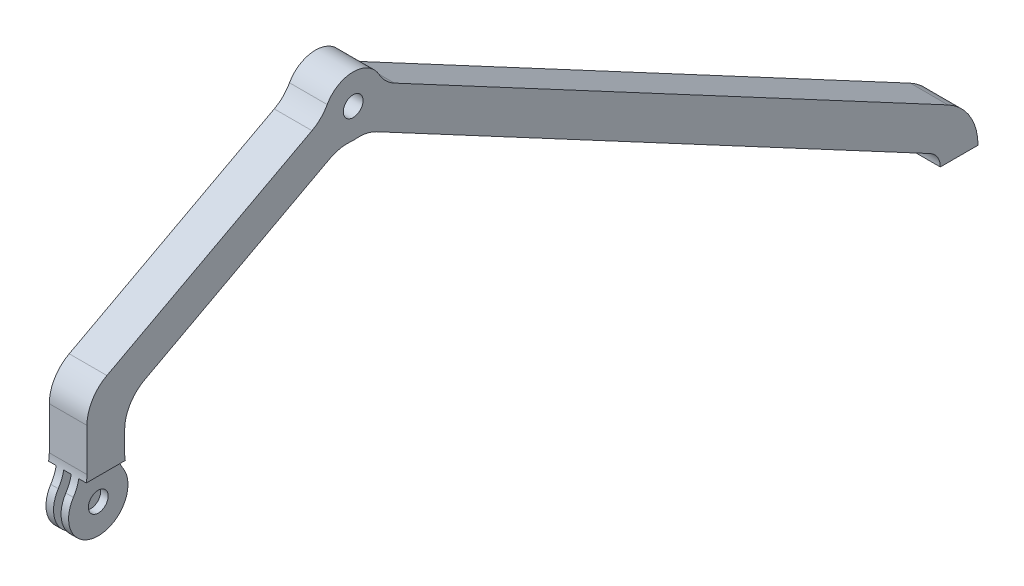
ISO-10303-21;
HEADER;
FILE_DESCRIPTION(('STEP AP214'),'2;1');
FILE_NAME('part.step','',(''),(''),'','','');
FILE_SCHEMA(('AUTOMOTIVE_DESIGN { 1 0 10303 214 1 1 1 1 }'));
ENDSEC;
DATA;
#1=APPLICATION_CONTEXT('core data for automotive mechanical design processes');
#2=APPLICATION_PROTOCOL_DEFINITION('international standard','automotive_design',2000,#1);
#3=PRODUCT_CONTEXT('',#1,'mechanical');
#4=PRODUCT('Part','Part','',(#3));
#5=PRODUCT_RELATED_PRODUCT_CATEGORY('part','',(#4));
#6=PRODUCT_DEFINITION_FORMATION('','',#4);
#7=PRODUCT_DEFINITION_CONTEXT('part definition',#1,'design');
#8=PRODUCT_DEFINITION('design','',#6,#7);
#9=PRODUCT_DEFINITION_SHAPE('','',#8);
#10=(LENGTH_UNIT() NAMED_UNIT(*) SI_UNIT(.MILLI.,.METRE.));
#11=(NAMED_UNIT(*) PLANE_ANGLE_UNIT() SI_UNIT($,.RADIAN.));
#12=(NAMED_UNIT(*) SI_UNIT($,.STERADIAN.) SOLID_ANGLE_UNIT());
#13=UNCERTAINTY_MEASURE_WITH_UNIT(LENGTH_MEASURE(1.E-05),#10,'distance_accuracy_value','');
#14=(GEOMETRIC_REPRESENTATION_CONTEXT(3) GLOBAL_UNCERTAINTY_ASSIGNED_CONTEXT((#13)) GLOBAL_UNIT_ASSIGNED_CONTEXT((#10,
#11,#12)) REPRESENTATION_CONTEXT('',''));
#15=CARTESIAN_POINT('',(0.,0.,0.));
#16=DIRECTION('',(0.,0.,1.));
#17=DIRECTION('',(1.,0.,0.));
#18=AXIS2_PLACEMENT_3D('',#15,#16,#17);
#19=CARTESIAN_POINT('',(-19.05,145.348430694647,19.0500000000001));
#20=DIRECTION('',(1.,0.,0.));
#21=DIRECTION('',(0.,0.,-1.));
#22=AXIS2_PLACEMENT_3D('',#19,#20,#21);
#23=PLANE('',#22);
#24=CARTESIAN_POINT('',(-19.05,225.,-250.));
#25=DIRECTION('',(1.,0.,0.));
#26=DIRECTION('',(0.,0.,-1.));
#27=AXIS2_PLACEMENT_3D('',#24,#25,#26);
#28=CIRCLE('',#27,10.0000000000001);
#29=CARTESIAN_POINT('',(-19.05,225.,-260.));
#30=VERTEX_POINT('',#29);
#31=EDGE_CURVE('E338',#30,#30,#28,.T.);
#32=ORIENTED_EDGE('',*,*,#31,.T.);
#33=EDGE_LOOP('',(#32));
#34=FACE_BOUND('',#33,.T.);
#35=DIRECTION('',(0.,0.,-1.));
#36=VECTOR('',#35,1.);
#37=CARTESIAN_POINT('',(-19.05,30.,19.0500000000001));
#38=LINE('',#37,#36);
#39=CARTESIAN_POINT('',(-19.05,30.,19.7048604417046));
#40=VERTEX_POINT('',#39);
#41=CARTESIAN_POINT('',(-19.05,30.,-19.7048604417045));
#42=VERTEX_POINT('',#41);
#43=EDGE_CURVE('E45',#40,#42,#38,.T.);
#44=ORIENTED_EDGE('',*,*,#43,.F.);
#45=CARTESIAN_POINT('',(-19.05,37.0335996090037,57.15));
#46=DIRECTION('',(1.,0.,0.));
#47=DIRECTION('',(0.,0.,-1.));
#48=AXIS2_PLACEMENT_3D('',#45,#46,#47);
#49=CIRCLE('',#48,38.1);
#50=CARTESIAN_POINT('',(-19.05,37.0335996090037,19.05));
#51=VERTEX_POINT('',#50);
#52=EDGE_CURVE('E240',#40,#51,#49,.T.);
#53=ORIENTED_EDGE('',*,*,#52,.T.);
#54=DIRECTION('',(0.,-1.,0.));
#55=VECTOR('',#54,1.);
#56=CARTESIAN_POINT('',(-19.05,145.348430694647,19.0500000000001));
#57=LINE('',#56,#55);
#58=CARTESIAN_POINT('',(-19.05,80.0449488571474,19.0500000000001));
#59=VERTEX_POINT('',#58);
#60=EDGE_CURVE('E351',#59,#51,#57,.T.);
#61=ORIENTED_EDGE('',*,*,#60,.F.);
#62=CARTESIAN_POINT('',(-19.05,80.0449488571474,-19.0499999999999));
#63=DIRECTION('',(1.,0.,0.));
#64=DIRECTION('',(0.,0.,-1.));
#65=AXIS2_PLACEMENT_3D('',#62,#63,#64);
#66=CIRCLE('',#65,38.1);
#67=CARTESIAN_POINT('',(-19.05,113.651438700337,-1.09968411365502));
#68=VERTEX_POINT('',#67);
#69=EDGE_CURVE('E424',#59,#68,#66,.F.);
#70=ORIENTED_EDGE('',*,*,#69,.T.);
#71=DIRECTION('',(0.,0.471136899904066,-0.882060100871129));
#72=VECTOR('',#71,1.);
#73=CARTESIAN_POINT('',(-19.05,102.888839079316,19.0500000000001));
#74=LINE('',#73,#72);
#75=CARTESIAN_POINT('',(-19.05,224.35534960952,-208.358981450089));
#76=VERTEX_POINT('',#75);
#77=EDGE_CURVE('E358',#68,#76,#74,.T.);
#78=ORIENTED_EDGE('',*,*,#77,.T.);
#79=CARTESIAN_POINT('',(-19.05,257.96183945271,-190.408665563744));
#80=DIRECTION('',(1.,0.,0.));
#81=DIRECTION('',(0.,0.,-1.));
#82=AXIS2_PLACEMENT_3D('',#79,#80,#81);
#83=CIRCLE('',#82,38.1);
#84=CARTESIAN_POINT('',(-19.05,239.520634120137,-223.748310821032));
#85=VERTEX_POINT('',#84);
#86=EDGE_CURVE('E261',#76,#85,#83,.T.);
#87=ORIENTED_EDGE('',*,*,#86,.T.);
#88=CARTESIAN_POINT('',(-19.05,225.,-250.));
#89=DIRECTION('',(1.,0.,0.));
#90=DIRECTION('',(0.,0.,-1.));
#91=AXIS2_PLACEMENT_3D('',#88,#89,#90);
#92=CIRCLE('',#91,30.);
#93=CARTESIAN_POINT('',(-19.05,239.520634120137,-276.251689178967));
#94=VERTEX_POINT('',#93);
#95=EDGE_CURVE('E334',#85,#94,#92,.F.);
#96=ORIENTED_EDGE('',*,*,#95,.T.);
#97=CARTESIAN_POINT('',(-19.05,257.96183945271,-309.591334436256));
#98=DIRECTION('',(1.,0.,0.));
#99=DIRECTION('',(0.,0.,-1.));
#100=AXIS2_PLACEMENT_3D('',#97,#98,#99);
#101=CIRCLE('',#100,38.1);
#102=CARTESIAN_POINT('',(-19.05,224.35534960952,-291.641018549911));
#103=VERTEX_POINT('',#102);
#104=EDGE_CURVE('E257',#94,#103,#101,.T.);
#105=ORIENTED_EDGE('',*,*,#104,.T.);
#106=DIRECTION('',(0.,-0.471136899904065,-0.882060100871129));
#107=VECTOR('',#106,1.);
#108=CARTESIAN_POINT('',(-19.05,246.597167790705,-250.));
#109=LINE('',#108,#107);
#110=CARTESIAN_POINT('',(-19.05,-74.590265235215,-851.325473829517));
#111=VERTEX_POINT('',#110);
#112=EDGE_CURVE('E372',#103,#111,#109,.T.);
#113=ORIENTED_EDGE('',*,*,#112,.T.);
#114=CARTESIAN_POINT('',(-19.05,-125.,-824.4));
#115=DIRECTION('',(-1.,0.,0.));
#116=DIRECTION('',(0.,0.,1.));
#117=AXIS2_PLACEMENT_3D('',#114,#115,#116);
#118=CIRCLE('',#117,57.1499999999999);
#119=CARTESIAN_POINT('',(-19.05,-125.,-881.55));
#120=VERTEX_POINT('',#119);
#121=EDGE_CURVE('E394',#111,#120,#118,.T.);
#122=ORIENTED_EDGE('',*,*,#121,.T.);
#123=DIRECTION('',(0.,0.,-1.));
#124=VECTOR('',#123,1.);
#125=CARTESIAN_POINT('',(-19.05,-125.,-764.694084134161));
#126=LINE('',#125,#124);
#127=CARTESIAN_POINT('',(-19.05,-125.,-843.45));
#128=VERTEX_POINT('',#127);
#129=EDGE_CURVE('E385',#128,#120,#126,.T.);
#130=ORIENTED_EDGE('',*,*,#129,.F.);
#131=CARTESIAN_POINT('',(-19.05,-125.,-824.4));
#132=DIRECTION('',(-1.,0.,0.));
#133=DIRECTION('',(0.,0.,1.));
#134=AXIS2_PLACEMENT_3D('',#131,#132,#133);
#135=CIRCLE('',#134,19.05);
#136=CARTESIAN_POINT('',(-19.05,-108.196755078405,-833.375157943173));
#137=VERTEX_POINT('',#136);
#138=EDGE_CURVE('E397',#137,#128,#135,.T.);
#139=ORIENTED_EDGE('',*,*,#138,.F.);
#140=DIRECTION('',(0.,-0.471136899904065,-0.882060100871129));
#141=VECTOR('',#140,1.);
#142=CARTESIAN_POINT('',(-19.05,203.402832209295,-250.));
#143=LINE('',#142,#141);
#144=CARTESIAN_POINT('',(-19.05,190.74885976633,-273.690702663566));
#145=VERTEX_POINT('',#144);
#146=EDGE_CURVE('E374',#145,#137,#143,.T.);
#147=ORIENTED_EDGE('',*,*,#146,.F.);
#148=CARTESIAN_POINT('',(-19.05,157.14236992314,-255.740386777221));
#149=DIRECTION('',(1.,0.,0.));
#150=DIRECTION('',(0.,0.,-1.));
#151=AXIS2_PLACEMENT_3D('',#148,#149,#150);
#152=CIRCLE('',#151,38.1);
#153=CARTESIAN_POINT('',(-19.05,195.106770891251,-252.528804747675));
#154=VERTEX_POINT('',#153);
#155=EDGE_CURVE('E242',#145,#154,#152,.T.);
#156=ORIENTED_EDGE('',*,*,#155,.T.);
#157=CARTESIAN_POINT('',(-19.05,195.106770891251,-247.471195252325));
#158=VERTEX_POINT('',#157);
#159=EDGE_CURVE('E330',#154,#158,#92,.F.);
#160=ORIENTED_EDGE('',*,*,#159,.T.);
#161=CARTESIAN_POINT('',(-19.05,157.14236992314,-244.259613222778));
#162=DIRECTION('',(1.,0.,0.));
#163=DIRECTION('',(0.,0.,-1.));
#164=AXIS2_PLACEMENT_3D('',#161,#162,#163);
#165=CIRCLE('',#164,38.1);
#166=CARTESIAN_POINT('',(-19.05,190.74885976633,-226.309297336434));
#167=VERTEX_POINT('',#166);
#168=EDGE_CURVE('E251',#158,#167,#165,.T.);
#169=ORIENTED_EDGE('',*,*,#168,.T.);
#170=DIRECTION('',(0.,0.471136899904066,-0.882060100871129));
#171=VECTOR('',#170,1.);
#172=CARTESIAN_POINT('',(-19.05,80.0449488571474,-19.0499999999999));
#173=LINE('',#172,#171);
#174=CARTESIAN_POINT('',(-19.05,90.8075484781688,-39.1996841136551));
#175=VERTEX_POINT('',#174);
#176=EDGE_CURVE('E361',#175,#167,#173,.T.);
#177=ORIENTED_EDGE('',*,*,#176,.F.);
#178=CARTESIAN_POINT('',(-19.05,57.2010586349788,-57.15));
#179=DIRECTION('',(1.,0.,0.));
#180=DIRECTION('',(0.,0.,-1.));
#181=AXIS2_PLACEMENT_3D('',#178,#179,#180);
#182=CIRCLE('',#181,38.1);
#183=CARTESIAN_POINT('',(-19.05,57.2010586349788,-19.05));
#184=VERTEX_POINT('',#183);
#185=EDGE_CURVE('E449',#175,#184,#182,.T.);
#186=ORIENTED_EDGE('',*,*,#185,.T.);
#187=DIRECTION('',(0.,-1.,0.));
#188=VECTOR('',#187,1.);
#189=CARTESIAN_POINT('',(-19.05,145.348430694647,-19.0499999999999));
#190=LINE('',#189,#188);
#191=CARTESIAN_POINT('',(-19.05,37.0335996090037,-19.05));
#192=VERTEX_POINT('',#191);
#193=EDGE_CURVE('E238',#184,#192,#190,.T.);
#194=ORIENTED_EDGE('',*,*,#193,.T.);
#195=CARTESIAN_POINT('',(-19.05,37.0335996090037,-57.15));
#196=DIRECTION('',(1.,0.,0.));
#197=DIRECTION('',(0.,0.,-1.));
#198=AXIS2_PLACEMENT_3D('',#195,#196,#197);
#199=CIRCLE('',#198,38.1);
#200=EDGE_CURVE('E232',#192,#42,#199,.T.);
#201=ORIENTED_EDGE('',*,*,#200,.T.);
#202=EDGE_LOOP('',(#44,#53,#61,#70,#78,#87,#96,#105,#113,#122,#130,#139,#147,#156,#160,#169,
#177,#186,#194,#201));
#203=FACE_BOUND('',#202,.T.);
#204=ADVANCED_FACE('F37',(#34,#203),#23,.F.);
#205=CARTESIAN_POINT('',(-19.05,0.,0.));
#206=DIRECTION('',(1.,0.,0.));
#207=DIRECTION('',(0.,0.,-1.));
#208=AXIS2_PLACEMENT_3D('',#205,#206,#207);
#209=CYLINDRICAL_SURFACE('',#208,10.);
#210=CARTESIAN_POINT('',(-11.43,0.,0.));
#211=DIRECTION('',(1.,0.,0.));
#212=DIRECTION('',(0.,0.,-1.));
#213=AXIS2_PLACEMENT_3D('',#210,#211,#212);
#214=CIRCLE('',#213,10.);
#215=CARTESIAN_POINT('',(-11.43,0.,-10.));
#216=VERTEX_POINT('',#215);
#217=EDGE_CURVE('E298',#216,#216,#214,.F.);
#218=ORIENTED_EDGE('',*,*,#217,.T.);
#219=EDGE_LOOP('',(#218));
#220=FACE_BOUND('',#219,.T.);
#221=CARTESIAN_POINT('',(-3.81,0.,0.));
#222=DIRECTION('',(1.,0.,0.));
#223=DIRECTION('',(0.,0.,-1.));
#224=AXIS2_PLACEMENT_3D('',#221,#222,#223);
#225=CIRCLE('',#224,10.);
#226=CARTESIAN_POINT('',(-3.81,0.,-10.));
#227=VERTEX_POINT('',#226);
#228=EDGE_CURVE('E310',#227,#227,#225,.F.);
#229=ORIENTED_EDGE('',*,*,#228,.F.);
#230=EDGE_LOOP('',(#229));
#231=FACE_BOUND('',#230,.T.);
#232=ADVANCED_FACE('F561',(#220,#231),#209,.F.);
#233=CARTESIAN_POINT('',(-103.902813742386,0.,0.));
#234=DIRECTION('',(1.,0.,0.));
#235=DIRECTION('',(0.,0.,-1.));
#236=AXIS2_PLACEMENT_3D('',#233,#234,#235);
#237=CYLINDRICAL_SURFACE('',#236,30.);
#238=DIRECTION('',(1.,0.,0.));
#239=VECTOR('',#238,1.);
#240=CARTESIAN_POINT('',(-103.902813742386,16.3143610612351,25.1762114537445));
#241=LINE('',#240,#239);
#242=CARTESIAN_POINT('',(-3.81000000000001,16.3143610612351,25.1762114537445));
#243=VERTEX_POINT('',#242);
#244=CARTESIAN_POINT('',(-11.43,16.3143610612351,25.1762114537445));
#245=VERTEX_POINT('',#244);
#246=EDGE_CURVE('E429',#243,#245,#241,.F.);
#247=ORIENTED_EDGE('',*,*,#246,.T.);
#248=CARTESIAN_POINT('',(-11.43,0.,0.));
#249=DIRECTION('',(1.,0.,0.));
#250=DIRECTION('',(0.,0.,-1.));
#251=AXIS2_PLACEMENT_3D('',#248,#249,#250);
#252=CIRCLE('',#251,30.);
#253=CARTESIAN_POINT('',(-11.43,16.3143610612351,-25.1762114537445));
#254=VERTEX_POINT('',#253);
#255=EDGE_CURVE('E553',#254,#245,#252,.F.);
#256=ORIENTED_EDGE('',*,*,#255,.F.);
#257=DIRECTION('',(1.,0.,0.));
#258=VECTOR('',#257,1.);
#259=CARTESIAN_POINT('',(-103.902813742386,16.3143610612351,-25.1762114537445));
#260=LINE('',#259,#258);
#261=CARTESIAN_POINT('',(-3.81000000000001,16.3143610612351,-25.1762114537445));
#262=VERTEX_POINT('',#261);
#263=EDGE_CURVE('E427',#254,#262,#260,.T.);
#264=ORIENTED_EDGE('',*,*,#263,.T.);
#265=CARTESIAN_POINT('',(-3.81000000000001,0.,0.));
#266=DIRECTION('',(1.,0.,0.));
#267=DIRECTION('',(0.,0.,-1.));
#268=AXIS2_PLACEMENT_3D('',#265,#266,#267);
#269=CIRCLE('',#268,30.);
#270=EDGE_CURVE('E281',#262,#243,#269,.F.);
#271=ORIENTED_EDGE('',*,*,#270,.T.);
#272=EDGE_LOOP('',(#247,#256,#264,#271));
#273=FACE_BOUND('',#272,.T.);
#274=ADVANCED_FACE('F552',(#273),#237,.T.);
#275=CARTESIAN_POINT('',(11.43,16.3143610612351,25.1762114537445));
#276=VERTEX_POINT('',#275);
#277=CARTESIAN_POINT('',(3.80999999999999,16.3143610612351,25.1762114537445));
#278=VERTEX_POINT('',#277);
#279=EDGE_CURVE('E430',#276,#278,#241,.F.);
#280=ORIENTED_EDGE('',*,*,#279,.T.);
#281=CARTESIAN_POINT('',(3.80999999999999,0.,0.));
#282=DIRECTION('',(1.,0.,0.));
#283=DIRECTION('',(0.,0.,-1.));
#284=AXIS2_PLACEMENT_3D('',#281,#282,#283);
#285=CIRCLE('',#284,30.);
#286=CARTESIAN_POINT('',(3.80999999999999,16.3143610612351,-25.1762114537445));
#287=VERTEX_POINT('',#286);
#288=EDGE_CURVE('E296',#287,#278,#285,.F.);
#289=ORIENTED_EDGE('',*,*,#288,.F.);
#290=CARTESIAN_POINT('',(11.43,16.3143610612351,-25.1762114537445));
#291=VERTEX_POINT('',#290);
#292=EDGE_CURVE('E426',#287,#291,#260,.T.);
#293=ORIENTED_EDGE('',*,*,#292,.T.);
#294=CARTESIAN_POINT('',(11.43,0.,0.));
#295=DIRECTION('',(1.,0.,0.));
#296=DIRECTION('',(0.,0.,-1.));
#297=AXIS2_PLACEMENT_3D('',#294,#295,#296);
#298=CIRCLE('',#297,30.);
#299=EDGE_CURVE('E321',#291,#276,#298,.F.);
#300=ORIENTED_EDGE('',*,*,#299,.T.);
#301=EDGE_LOOP('',(#280,#289,#293,#300));
#302=FACE_BOUND('',#301,.T.);
#303=ADVANCED_FACE('F545',(#302),#237,.T.);
#304=CARTESIAN_POINT('',(-103.902813742386,37.0335996090037,57.15));
#305=DIRECTION('',(1.,0.,0.));
#306=DIRECTION('',(0.,0.,-1.));
#307=AXIS2_PLACEMENT_3D('',#304,#305,#306);
#308=CYLINDRICAL_SURFACE('',#307,38.1);
#309=DIRECTION('',(1.,0.,0.));
#310=VECTOR('',#309,1.);
#311=CARTESIAN_POINT('',(-103.902813742386,30.,19.7048604417046));
#312=LINE('',#311,#310);
#313=CARTESIAN_POINT('',(-11.43,30.,19.7048604417046));
#314=VERTEX_POINT('',#313);
#315=EDGE_CURVE('E52',#314,#40,#312,.F.);
#316=ORIENTED_EDGE('',*,*,#315,.F.);
#317=CARTESIAN_POINT('',(-11.43,37.0335996090037,57.15));
#318=DIRECTION('',(1.,0.,0.));
#319=DIRECTION('',(0.,0.,-1.));
#320=AXIS2_PLACEMENT_3D('',#317,#318,#319);
#321=CIRCLE('',#320,38.1);
#322=EDGE_CURVE('E549',#314,#245,#321,.F.);
#323=ORIENTED_EDGE('',*,*,#322,.T.);
#324=ORIENTED_EDGE('',*,*,#246,.F.);
#325=CARTESIAN_POINT('',(-3.81000000000001,37.0335996090037,57.15));
#326=DIRECTION('',(1.,0.,0.));
#327=DIRECTION('',(0.,0.,-1.));
#328=AXIS2_PLACEMENT_3D('',#325,#326,#327);
#329=CIRCLE('',#328,38.1);
#330=CARTESIAN_POINT('',(-3.81,30.,19.7048604417046));
#331=VERTEX_POINT('',#330);
#332=EDGE_CURVE('E308',#331,#243,#329,.F.);
#333=ORIENTED_EDGE('',*,*,#332,.F.);
#334=DIRECTION('',(1.,0.,0.));
#335=VECTOR('',#334,1.);
#336=CARTESIAN_POINT('',(-103.902813742386,30.,19.7048604417046));
#337=LINE('',#336,#335);
#338=CARTESIAN_POINT('',(3.81,30.,19.7048604417046));
#339=VERTEX_POINT('',#338);
#340=EDGE_CURVE('E294',#339,#331,#337,.F.);
#341=ORIENTED_EDGE('',*,*,#340,.F.);
#342=CARTESIAN_POINT('',(3.80999999999999,37.0335996090037,57.15));
#343=DIRECTION('',(1.,0.,0.));
#344=DIRECTION('',(0.,0.,-1.));
#345=AXIS2_PLACEMENT_3D('',#342,#343,#344);
#346=CIRCLE('',#345,38.1);
#347=EDGE_CURVE('E293',#339,#278,#346,.F.);
#348=ORIENTED_EDGE('',*,*,#347,.T.);
#349=ORIENTED_EDGE('',*,*,#279,.F.);
#350=CARTESIAN_POINT('',(11.43,37.0335996090037,57.15));
#351=DIRECTION('',(1.,0.,0.));
#352=DIRECTION('',(0.,0.,-1.));
#353=AXIS2_PLACEMENT_3D('',#350,#351,#352);
#354=CIRCLE('',#353,38.1);
#355=CARTESIAN_POINT('',(11.43,30.,19.7048604417046));
#356=VERTEX_POINT('',#355);
#357=EDGE_CURVE('E323',#356,#276,#354,.F.);
#358=ORIENTED_EDGE('',*,*,#357,.F.);
#359=DIRECTION('',(1.,0.,0.));
#360=VECTOR('',#359,1.);
#361=CARTESIAN_POINT('',(-103.902813742386,30.,19.7048604417046));
#362=LINE('',#361,#360);
#363=CARTESIAN_POINT('',(19.05,30.,19.7048604417046));
#364=VERTEX_POINT('',#363);
#365=EDGE_CURVE('E319',#364,#356,#362,.F.);
#366=ORIENTED_EDGE('',*,*,#365,.F.);
#367=CARTESIAN_POINT('',(19.05,37.0335996090037,57.15));
#368=DIRECTION('',(-1.,0.,0.));
#369=DIRECTION('',(0.,0.,1.));
#370=AXIS2_PLACEMENT_3D('',#367,#368,#369);
#371=CIRCLE('',#370,38.1);
#372=CARTESIAN_POINT('',(19.05,37.0335996090037,19.05));
#373=VERTEX_POINT('',#372);
#374=EDGE_CURVE('E244',#373,#364,#371,.T.);
#375=ORIENTED_EDGE('',*,*,#374,.F.);
#376=DIRECTION('',(1.,0.,0.));
#377=VECTOR('',#376,1.);
#378=CARTESIAN_POINT('',(-19.05,37.0335996090037,19.05));
#379=LINE('',#378,#377);
#380=EDGE_CURVE('E419',#51,#373,#379,.T.);
#381=ORIENTED_EDGE('',*,*,#380,.F.);
#382=ORIENTED_EDGE('',*,*,#52,.F.);
#383=EDGE_LOOP('',(#316,#323,#324,#333,#341,#348,#349,#358,#366,#375,#381,#382));
#384=FACE_BOUND('',#383,.T.);
#385=ADVANCED_FACE('F460',(#384),#308,.F.);
#386=CARTESIAN_POINT('',(-103.902813742386,37.0335996090037,-57.15));
#387=DIRECTION('',(1.,0.,0.));
#388=DIRECTION('',(0.,0.,-1.));
#389=AXIS2_PLACEMENT_3D('',#386,#387,#388);
#390=CYLINDRICAL_SURFACE('',#389,38.1);
#391=ORIENTED_EDGE('',*,*,#263,.F.);
#392=CARTESIAN_POINT('',(-11.43,37.0335996090037,-57.15));
#393=DIRECTION('',(1.,0.,0.));
#394=DIRECTION('',(0.,0.,-1.));
#395=AXIS2_PLACEMENT_3D('',#392,#393,#394);
#396=CIRCLE('',#395,38.1);
#397=CARTESIAN_POINT('',(-11.43,30.,-19.7048604417045));
#398=VERTEX_POINT('',#397);
#399=EDGE_CURVE('E12',#254,#398,#396,.F.);
#400=ORIENTED_EDGE('',*,*,#399,.T.);
#401=DIRECTION('',(1.,0.,0.));
#402=VECTOR('',#401,1.);
#403=CARTESIAN_POINT('',(-103.902813742386,30.,-19.7048604417045));
#404=LINE('',#403,#402);
#405=EDGE_CURVE('E222',#42,#398,#404,.T.);
#406=ORIENTED_EDGE('',*,*,#405,.F.);
#407=ORIENTED_EDGE('',*,*,#200,.F.);
#408=DIRECTION('',(1.,0.,0.));
#409=VECTOR('',#408,1.);
#410=CARTESIAN_POINT('',(-19.05,37.0335996090037,-19.05));
#411=LINE('',#410,#409);
#412=CARTESIAN_POINT('',(19.05,37.0335996090037,-19.05));
#413=VERTEX_POINT('',#412);
#414=EDGE_CURVE('E408',#413,#192,#411,.F.);
#415=ORIENTED_EDGE('',*,*,#414,.F.);
#416=CARTESIAN_POINT('',(19.05,37.0335996090037,-57.15));
#417=DIRECTION('',(-1.,0.,0.));
#418=DIRECTION('',(0.,0.,1.));
#419=AXIS2_PLACEMENT_3D('',#416,#417,#418);
#420=CIRCLE('',#419,38.1);
#421=CARTESIAN_POINT('',(19.05,30.,-19.7048604417045));
#422=VERTEX_POINT('',#421);
#423=EDGE_CURVE('E239',#422,#413,#420,.T.);
#424=ORIENTED_EDGE('',*,*,#423,.F.);
#425=DIRECTION('',(1.,0.,0.));
#426=VECTOR('',#425,1.);
#427=CARTESIAN_POINT('',(-103.902813742386,30.,-19.7048604417045));
#428=LINE('',#427,#426);
#429=CARTESIAN_POINT('',(11.43,30.,-19.7048604417045));
#430=VERTEX_POINT('',#429);
#431=EDGE_CURVE('E263',#430,#422,#428,.T.);
#432=ORIENTED_EDGE('',*,*,#431,.F.);
#433=CARTESIAN_POINT('',(11.43,37.0335996090037,-57.15));
#434=DIRECTION('',(1.,0.,0.));
#435=DIRECTION('',(0.,0.,-1.));
#436=AXIS2_PLACEMENT_3D('',#433,#434,#435);
#437=CIRCLE('',#436,38.1);
#438=EDGE_CURVE('E265',#291,#430,#437,.F.);
#439=ORIENTED_EDGE('',*,*,#438,.F.);
#440=ORIENTED_EDGE('',*,*,#292,.F.);
#441=CARTESIAN_POINT('',(3.80999999999999,37.0335996090037,-57.15));
#442=DIRECTION('',(1.,0.,0.));
#443=DIRECTION('',(0.,0.,-1.));
#444=AXIS2_PLACEMENT_3D('',#441,#442,#443);
#445=CIRCLE('',#444,38.1);
#446=CARTESIAN_POINT('',(3.81,30.,-19.7048604417045));
#447=VERTEX_POINT('',#446);
#448=EDGE_CURVE('E270',#287,#447,#445,.F.);
#449=ORIENTED_EDGE('',*,*,#448,.T.);
#450=DIRECTION('',(1.,0.,0.));
#451=VECTOR('',#450,1.);
#452=CARTESIAN_POINT('',(-103.902813742386,30.,-19.7048604417045));
#453=LINE('',#452,#451);
#454=CARTESIAN_POINT('',(-3.81000000000001,30.,-19.7048604417045));
#455=VERTEX_POINT('',#454);
#456=EDGE_CURVE('E268',#455,#447,#453,.T.);
#457=ORIENTED_EDGE('',*,*,#456,.F.);
#458=CARTESIAN_POINT('',(-3.81000000000001,37.0335996090037,-57.15));
#459=DIRECTION('',(1.,0.,0.));
#460=DIRECTION('',(0.,0.,-1.));
#461=AXIS2_PLACEMENT_3D('',#458,#459,#460);
#462=CIRCLE('',#461,38.1);
#463=EDGE_CURVE('E227',#262,#455,#462,.F.);
#464=ORIENTED_EDGE('',*,*,#463,.F.);
#465=EDGE_LOOP('',(#391,#400,#406,#407,#415,#424,#432,#439,#440,#449,#457,#464));
#466=FACE_BOUND('',#465,.T.);
#467=ADVANCED_FACE('F230',(#466),#390,.F.);
#468=CARTESIAN_POINT('',(19.05,145.348430694647,19.0500000000001));
#469=DIRECTION('',(-1.,0.,0.));
#470=DIRECTION('',(0.,0.,1.));
#471=AXIS2_PLACEMENT_3D('',#468,#469,#470);
#472=PLANE('',#471);
#473=CARTESIAN_POINT('',(19.05,225.,-250.));
#474=DIRECTION('',(1.,0.,0.));
#475=DIRECTION('',(0.,0.,-1.));
#476=AXIS2_PLACEMENT_3D('',#473,#474,#475);
#477=CIRCLE('',#476,10.0000000000001);
#478=CARTESIAN_POINT('',(19.05,225.,-260.));
#479=VERTEX_POINT('',#478);
#480=EDGE_CURVE('E333',#479,#479,#477,.T.);
#481=ORIENTED_EDGE('',*,*,#480,.F.);
#482=EDGE_LOOP('',(#481));
#483=FACE_BOUND('',#482,.T.);
#484=DIRECTION('',(0.,0.,-1.));
#485=VECTOR('',#484,1.);
#486=CARTESIAN_POINT('',(19.05,30.,0.));
#487=LINE('',#486,#485);
#488=EDGE_CURVE('E316',#364,#422,#487,.T.);
#489=ORIENTED_EDGE('',*,*,#488,.T.);
#490=ORIENTED_EDGE('',*,*,#423,.T.);
#491=DIRECTION('',(0.,-1.,0.));
#492=VECTOR('',#491,1.);
#493=CARTESIAN_POINT('',(19.05,145.348430694647,-19.0499999999999));
#494=LINE('',#493,#492);
#495=CARTESIAN_POINT('',(19.05,57.2010586349788,-19.05));
#496=VERTEX_POINT('',#495);
#497=EDGE_CURVE('E355',#496,#413,#494,.T.);
#498=ORIENTED_EDGE('',*,*,#497,.F.);
#499=CARTESIAN_POINT('',(19.05,57.2010586349788,-57.15));
#500=DIRECTION('',(-1.,0.,0.));
#501=DIRECTION('',(0.,0.,1.));
#502=AXIS2_PLACEMENT_3D('',#499,#500,#501);
#503=CIRCLE('',#502,38.1);
#504=CARTESIAN_POINT('',(19.05,90.8075484781688,-39.1996841136551));
#505=VERTEX_POINT('',#504);
#506=EDGE_CURVE('E451',#496,#505,#503,.T.);
#507=ORIENTED_EDGE('',*,*,#506,.T.);
#508=DIRECTION('',(0.,0.471136899904066,-0.882060100871129));
#509=VECTOR('',#508,1.);
#510=CARTESIAN_POINT('',(19.05,80.0449488571474,-19.05));
#511=LINE('',#510,#509);
#512=CARTESIAN_POINT('',(19.05,190.74885976633,-226.309297336434));
#513=VERTEX_POINT('',#512);
#514=EDGE_CURVE('E364',#505,#513,#511,.T.);
#515=ORIENTED_EDGE('',*,*,#514,.T.);
#516=CARTESIAN_POINT('',(19.05,157.14236992314,-244.259613222778));
#517=DIRECTION('',(-1.,0.,0.));
#518=DIRECTION('',(0.,0.,1.));
#519=AXIS2_PLACEMENT_3D('',#516,#517,#518);
#520=CIRCLE('',#519,38.1);
#521=CARTESIAN_POINT('',(19.05,195.106770891251,-247.471195252325));
#522=VERTEX_POINT('',#521);
#523=EDGE_CURVE('E253',#513,#522,#520,.T.);
#524=ORIENTED_EDGE('',*,*,#523,.T.);
#525=CARTESIAN_POINT('',(19.05,225.,-250.));
#526=DIRECTION('',(1.,0.,0.));
#527=DIRECTION('',(0.,0.,-1.));
#528=AXIS2_PLACEMENT_3D('',#525,#526,#527);
#529=CIRCLE('',#528,30.);
#530=CARTESIAN_POINT('',(19.05,195.106770891251,-252.528804747675));
#531=VERTEX_POINT('',#530);
#532=EDGE_CURVE('E329',#522,#531,#529,.T.);
#533=ORIENTED_EDGE('',*,*,#532,.T.);
#534=CARTESIAN_POINT('',(19.05,157.14236992314,-255.740386777221));
#535=DIRECTION('',(-1.,0.,0.));
#536=DIRECTION('',(0.,0.,1.));
#537=AXIS2_PLACEMENT_3D('',#534,#535,#536);
#538=CIRCLE('',#537,38.1);
#539=CARTESIAN_POINT('',(19.05,190.74885976633,-273.690702663566));
#540=VERTEX_POINT('',#539);
#541=EDGE_CURVE('E249',#531,#540,#538,.T.);
#542=ORIENTED_EDGE('',*,*,#541,.T.);
#543=DIRECTION('',(0.,-0.471136899904065,-0.882060100871129));
#544=VECTOR('',#543,1.);
#545=CARTESIAN_POINT('',(19.05,203.402832209295,-250.));
#546=LINE('',#545,#544);
#547=CARTESIAN_POINT('',(19.05,-108.196755078405,-833.375157943173));
#548=VERTEX_POINT('',#547);
#549=EDGE_CURVE('E348',#540,#548,#546,.T.);
#550=ORIENTED_EDGE('',*,*,#549,.T.);
#551=CARTESIAN_POINT('',(19.05,-125.,-824.4));
#552=DIRECTION('',(-1.,0.,0.));
#553=DIRECTION('',(0.,0.,1.));
#554=AXIS2_PLACEMENT_3D('',#551,#552,#553);
#555=CIRCLE('',#554,19.05);
#556=CARTESIAN_POINT('',(19.05,-125.,-843.45));
#557=VERTEX_POINT('',#556);
#558=EDGE_CURVE('E400',#548,#557,#555,.T.);
#559=ORIENTED_EDGE('',*,*,#558,.T.);
#560=DIRECTION('',(0.,0.,1.));
#561=VECTOR('',#560,1.);
#562=CARTESIAN_POINT('',(19.05,-125.,-764.694084134161));
#563=LINE('',#562,#561);
#564=CARTESIAN_POINT('',(19.05,-125.,-881.55));
#565=VERTEX_POINT('',#564);
#566=EDGE_CURVE('E379',#565,#557,#563,.T.);
#567=ORIENTED_EDGE('',*,*,#566,.F.);
#568=CARTESIAN_POINT('',(19.05,-125.,-824.4));
#569=DIRECTION('',(-1.,0.,0.));
#570=DIRECTION('',(0.,0.,1.));
#571=AXIS2_PLACEMENT_3D('',#568,#569,#570);
#572=CIRCLE('',#571,57.1499999999999);
#573=CARTESIAN_POINT('',(19.05,-74.5902652352151,-851.325473829517));
#574=VERTEX_POINT('',#573);
#575=EDGE_CURVE('E391',#574,#565,#572,.T.);
#576=ORIENTED_EDGE('',*,*,#575,.F.);
#577=DIRECTION('',(0.,-0.471136899904065,-0.882060100871129));
#578=VECTOR('',#577,1.);
#579=CARTESIAN_POINT('',(19.05,246.597167790705,-250.));
#580=LINE('',#579,#578);
#581=CARTESIAN_POINT('',(19.05,224.35534960952,-291.641018549911));
#582=VERTEX_POINT('',#581);
#583=EDGE_CURVE('E370',#582,#574,#580,.T.);
#584=ORIENTED_EDGE('',*,*,#583,.F.);
#585=CARTESIAN_POINT('',(19.05,257.96183945271,-309.591334436256));
#586=DIRECTION('',(-1.,0.,0.));
#587=DIRECTION('',(0.,0.,1.));
#588=AXIS2_PLACEMENT_3D('',#585,#586,#587);
#589=CIRCLE('',#588,38.1);
#590=CARTESIAN_POINT('',(19.05,239.520634120137,-276.251689178967));
#591=VERTEX_POINT('',#590);
#592=EDGE_CURVE('E255',#582,#591,#589,.T.);
#593=ORIENTED_EDGE('',*,*,#592,.T.);
#594=CARTESIAN_POINT('',(19.05,239.520634120137,-223.748310821032));
#595=VERTEX_POINT('',#594);
#596=EDGE_CURVE('E337',#591,#595,#529,.T.);
#597=ORIENTED_EDGE('',*,*,#596,.T.);
#598=CARTESIAN_POINT('',(19.05,257.96183945271,-190.408665563744));
#599=DIRECTION('',(-1.,0.,0.));
#600=DIRECTION('',(0.,0.,1.));
#601=AXIS2_PLACEMENT_3D('',#598,#599,#600);
#602=CIRCLE('',#601,38.1);
#603=CARTESIAN_POINT('',(19.05,224.35534960952,-208.358981450089));
#604=VERTEX_POINT('',#603);
#605=EDGE_CURVE('E259',#595,#604,#602,.T.);
#606=ORIENTED_EDGE('',*,*,#605,.T.);
#607=DIRECTION('',(0.,0.471136899904066,-0.882060100871129));
#608=VECTOR('',#607,1.);
#609=CARTESIAN_POINT('',(19.05,102.888839079316,19.0500000000001));
#610=LINE('',#609,#608);
#611=CARTESIAN_POINT('',(19.05,113.651438700337,-1.09968411365503));
#612=VERTEX_POINT('',#611);
#613=EDGE_CURVE('E367',#612,#604,#610,.T.);
#614=ORIENTED_EDGE('',*,*,#613,.F.);
#615=CARTESIAN_POINT('',(19.05,80.0449488571474,-19.0499999999999));
#616=DIRECTION('',(-1.,0.,0.));
#617=DIRECTION('',(0.,0.,1.));
#618=AXIS2_PLACEMENT_3D('',#615,#616,#617);
#619=CIRCLE('',#618,38.1);
#620=CARTESIAN_POINT('',(19.05,80.0449488571474,19.0500000000001));
#621=VERTEX_POINT('',#620);
#622=EDGE_CURVE('E417',#612,#621,#619,.F.);
#623=ORIENTED_EDGE('',*,*,#622,.T.);
#624=DIRECTION('',(0.,-1.,0.));
#625=VECTOR('',#624,1.);
#626=CARTESIAN_POINT('',(19.05,145.348430694647,19.0500000000001));
#627=LINE('',#626,#625);
#628=EDGE_CURVE('E341',#621,#373,#627,.T.);
#629=ORIENTED_EDGE('',*,*,#628,.T.);
#630=ORIENTED_EDGE('',*,*,#374,.T.);
#631=EDGE_LOOP('',(#489,#490,#498,#507,#515,#524,#533,#542,#550,#559,#567,#576,#584,#593,#597,
#606,#614,#623,#629,#630));
#632=FACE_BOUND('',#631,.T.);
#633=ADVANCED_FACE('F454',(#483,#632),#472,.F.);
#634=CARTESIAN_POINT('',(3.80999999999999,0.,0.));
#635=DIRECTION('',(1.,0.,0.));
#636=DIRECTION('',(0.,0.,-1.));
#637=AXIS2_PLACEMENT_3D('',#634,#635,#636);
#638=CIRCLE('',#637,10.);
#639=CARTESIAN_POINT('',(3.80999999999999,0.,-10.));
#640=VERTEX_POINT('',#639);
#641=EDGE_CURVE('E304',#640,#640,#638,.F.);
#642=ORIENTED_EDGE('',*,*,#641,.T.);
#643=EDGE_LOOP('',(#642));
#644=FACE_BOUND('',#643,.T.);
#645=CARTESIAN_POINT('',(11.43,0.,0.));
#646=DIRECTION('',(1.,0.,0.));
#647=DIRECTION('',(0.,0.,-1.));
#648=AXIS2_PLACEMENT_3D('',#645,#646,#647);
#649=CIRCLE('',#648,10.);
#650=CARTESIAN_POINT('',(11.43,0.,-10.));
#651=VERTEX_POINT('',#650);
#652=EDGE_CURVE('E326',#651,#651,#649,.F.);
#653=ORIENTED_EDGE('',*,*,#652,.F.);
#654=EDGE_LOOP('',(#653));
#655=FACE_BOUND('',#654,.T.);
#656=ADVANCED_FACE('F580',(#644,#655),#209,.F.);
#657=CARTESIAN_POINT('',(0.,-125.,-824.4));
#658=DIRECTION('',(-1.,0.,0.));
#659=DIRECTION('',(0.,0.,1.));
#660=AXIS2_PLACEMENT_3D('',#657,#658,#659);
#661=CYLINDRICAL_SURFACE('',#660,19.05);
#662=DIRECTION('',(-1.,0.,0.));
#663=VECTOR('',#662,1.);
#664=CARTESIAN_POINT('',(-19.05,-108.196755078405,-833.375157943173));
#665=LINE('',#664,#663);
#666=EDGE_CURVE('E347',#548,#137,#665,.T.);
#667=ORIENTED_EDGE('',*,*,#666,.T.);
#668=ORIENTED_EDGE('',*,*,#138,.T.);
#669=DIRECTION('',(-1.,0.,0.));
#670=VECTOR('',#669,1.);
#671=CARTESIAN_POINT('',(-19.05,-125.,-843.45));
#672=LINE('',#671,#670);
#673=EDGE_CURVE('E388',#557,#128,#672,.T.);
#674=ORIENTED_EDGE('',*,*,#673,.F.);
#675=ORIENTED_EDGE('',*,*,#558,.F.);
#676=EDGE_LOOP('',(#667,#668,#674,#675));
#677=FACE_BOUND('',#676,.T.);
#678=ADVANCED_FACE('F504',(#677),#661,.F.);
#679=CARTESIAN_POINT('',(0.,-125.,-824.4));
#680=DIRECTION('',(-1.,0.,0.));
#681=DIRECTION('',(0.,0.,1.));
#682=AXIS2_PLACEMENT_3D('',#679,#680,#681);
#683=CYLINDRICAL_SURFACE('',#682,57.1499999999999);
#684=DIRECTION('',(1.,0.,0.));
#685=VECTOR('',#684,1.);
#686=CARTESIAN_POINT('',(-19.05,-74.5902652352151,-851.325473829517));
#687=LINE('',#686,#685);
#688=EDGE_CURVE('E344',#111,#574,#687,.T.);
#689=ORIENTED_EDGE('',*,*,#688,.T.);
#690=ORIENTED_EDGE('',*,*,#575,.T.);
#691=DIRECTION('',(1.,0.,0.));
#692=VECTOR('',#691,1.);
#693=CARTESIAN_POINT('',(-19.05,-125.,-881.55));
#694=LINE('',#693,#692);
#695=EDGE_CURVE('E382',#120,#565,#694,.T.);
#696=ORIENTED_EDGE('',*,*,#695,.F.);
#697=ORIENTED_EDGE('',*,*,#121,.F.);
#698=EDGE_LOOP('',(#689,#690,#696,#697));
#699=FACE_BOUND('',#698,.T.);
#700=ADVANCED_FACE('F497',(#699),#683,.T.);
#701=CARTESIAN_POINT('',(-19.05,246.597167790705,-250.));
#702=DIRECTION('',(0.,-0.882060100871129,0.471136899904065));
#703=DIRECTION('',(0.,-0.471136899904065,-0.88206010087113));
#704=AXIS2_PLACEMENT_3D('',#701,#702,#703);
#705=PLANE('',#704);
#706=ORIENTED_EDGE('',*,*,#112,.F.);
#707=DIRECTION('',(1.,0.,0.));
#708=VECTOR('',#707,1.);
#709=CARTESIAN_POINT('',(-19.05,224.35534960952,-291.641018549911));
#710=LINE('',#709,#708);
#711=EDGE_CURVE('E441',#103,#582,#710,.T.);
#712=ORIENTED_EDGE('',*,*,#711,.T.);
#713=ORIENTED_EDGE('',*,*,#583,.T.);
#714=ORIENTED_EDGE('',*,*,#688,.F.);
#715=EDGE_LOOP('',(#706,#712,#713,#714));
#716=FACE_BOUND('',#715,.T.);
#717=ADVANCED_FACE('F492',(#716),#705,.F.);
#718=CARTESIAN_POINT('',(-19.05,203.402832209295,-250.));
#719=DIRECTION('',(0.,0.882060100871129,-0.471136899904065));
#720=DIRECTION('',(0.,0.471136899904065,0.88206010087113));
#721=AXIS2_PLACEMENT_3D('',#718,#719,#720);
#722=PLANE('',#721);
#723=ORIENTED_EDGE('',*,*,#549,.F.);
#724=DIRECTION('',(1.,0.,0.));
#725=VECTOR('',#724,1.);
#726=CARTESIAN_POINT('',(-19.05,190.74885976633,-273.690702663566));
#727=LINE('',#726,#725);
#728=EDGE_CURVE('E433',#540,#145,#727,.F.);
#729=ORIENTED_EDGE('',*,*,#728,.T.);
#730=ORIENTED_EDGE('',*,*,#146,.T.);
#731=ORIENTED_EDGE('',*,*,#666,.F.);
#732=EDGE_LOOP('',(#723,#729,#730,#731));
#733=FACE_BOUND('',#732,.T.);
#734=ADVANCED_FACE('F508',(#733),#722,.F.);
#735=CARTESIAN_POINT('',(-19.05,102.888839079316,19.0500000000001));
#736=DIRECTION('',(0.,0.882060100871129,0.471136899904066));
#737=DIRECTION('',(0.,-0.471136899904066,0.882060100871129));
#738=AXIS2_PLACEMENT_3D('',#735,#736,#737);
#739=PLANE('',#738);
#740=ORIENTED_EDGE('',*,*,#77,.F.);
#741=DIRECTION('',(1.,0.,0.));
#742=VECTOR('',#741,1.);
#743=CARTESIAN_POINT('',(19.05,113.651438700337,-1.09968411365504));
#744=LINE('',#743,#742);
#745=EDGE_CURVE('E414',#68,#612,#744,.T.);
#746=ORIENTED_EDGE('',*,*,#745,.T.);
#747=ORIENTED_EDGE('',*,*,#613,.T.);
#748=DIRECTION('',(-1.,0.,0.));
#749=VECTOR('',#748,1.);
#750=CARTESIAN_POINT('',(-19.05,224.35534960952,-208.358981450089));
#751=LINE('',#750,#749);
#752=EDGE_CURVE('E412',#604,#76,#751,.T.);
#753=ORIENTED_EDGE('',*,*,#752,.T.);
#754=EDGE_LOOP('',(#740,#746,#747,#753));
#755=FACE_BOUND('',#754,.T.);
#756=ADVANCED_FACE('F473',(#755),#739,.T.);
#757=CARTESIAN_POINT('',(-19.05,80.0449488571474,-19.0499999999999));
#758=DIRECTION('',(0.,-0.882060100871129,-0.471136899904066));
#759=DIRECTION('',(0.,0.471136899904066,-0.882060100871129));
#760=AXIS2_PLACEMENT_3D('',#757,#758,#759);
#761=PLANE('',#760);
#762=ORIENTED_EDGE('',*,*,#514,.F.);
#763=DIRECTION('',(-1.,0.,0.));
#764=VECTOR('',#763,1.);
#765=CARTESIAN_POINT('',(-19.05,90.8075484781688,-39.1996841136551));
#766=LINE('',#765,#764);
#767=EDGE_CURVE('E405',#505,#175,#766,.T.);
#768=ORIENTED_EDGE('',*,*,#767,.T.);
#769=ORIENTED_EDGE('',*,*,#176,.T.);
#770=DIRECTION('',(-1.,0.,0.));
#771=VECTOR('',#770,1.);
#772=CARTESIAN_POINT('',(19.05,190.74885976633,-226.309297336434));
#773=LINE('',#772,#771);
#774=EDGE_CURVE('E403',#167,#513,#773,.F.);
#775=ORIENTED_EDGE('',*,*,#774,.T.);
#776=EDGE_LOOP('',(#762,#768,#769,#775));
#777=FACE_BOUND('',#776,.T.);
#778=ADVANCED_FACE('F526',(#777),#761,.T.);
#779=CARTESIAN_POINT('',(-19.05,145.348430694647,19.0500000000001));
#780=DIRECTION('',(0.,0.,-1.));
#781=DIRECTION('',(0.,1.,0.));
#782=AXIS2_PLACEMENT_3D('',#779,#780,#781);
#783=PLANE('',#782);
#784=ORIENTED_EDGE('',*,*,#628,.F.);
#785=DIRECTION('',(1.,0.,0.));
#786=VECTOR('',#785,1.);
#787=CARTESIAN_POINT('',(-19.05,80.0449488571474,19.0500000000001));
#788=LINE('',#787,#786);
#789=EDGE_CURVE('E422',#621,#59,#788,.F.);
#790=ORIENTED_EDGE('',*,*,#789,.T.);
#791=ORIENTED_EDGE('',*,*,#60,.T.);
#792=ORIENTED_EDGE('',*,*,#380,.T.);
#793=EDGE_LOOP('',(#784,#790,#791,#792));
#794=FACE_BOUND('',#793,.T.);
#795=ADVANCED_FACE('F463',(#794),#783,.F.);
#796=CARTESIAN_POINT('',(-19.05,145.348430694647,-19.0499999999999));
#797=DIRECTION('',(0.,0.,1.));
#798=DIRECTION('',(0.,-1.,0.));
#799=AXIS2_PLACEMENT_3D('',#796,#797,#798);
#800=PLANE('',#799);
#801=ORIENTED_EDGE('',*,*,#193,.F.);
#802=DIRECTION('',(-1.,0.,0.));
#803=VECTOR('',#802,1.);
#804=CARTESIAN_POINT('',(-19.05,57.2010586349788,-19.05));
#805=LINE('',#804,#803);
#806=EDGE_CURVE('E410',#184,#496,#805,.F.);
#807=ORIENTED_EDGE('',*,*,#806,.T.);
#808=ORIENTED_EDGE('',*,*,#497,.T.);
#809=ORIENTED_EDGE('',*,*,#414,.T.);
#810=EDGE_LOOP('',(#801,#807,#808,#809));
#811=FACE_BOUND('',#810,.T.);
#812=ADVANCED_FACE('F533',(#811),#800,.F.);
#813=CARTESIAN_POINT('',(0.,-125.,-862.5));
#814=DIRECTION('',(0.,-1.,0.));
#815=DIRECTION('',(0.,0.,-1.));
#816=AXIS2_PLACEMENT_3D('',#813,#814,#815);
#817=PLANE('',#816);
#818=ORIENTED_EDGE('',*,*,#566,.T.);
#819=ORIENTED_EDGE('',*,*,#673,.T.);
#820=ORIENTED_EDGE('',*,*,#129,.T.);
#821=ORIENTED_EDGE('',*,*,#695,.T.);
#822=EDGE_LOOP('',(#818,#819,#820,#821));
#823=FACE_BOUND('',#822,.T.);
#824=ADVANCED_FACE('F501',(#823),#817,.T.);
#825=CARTESIAN_POINT('',(-19.05,225.,-250.));
#826=DIRECTION('',(1.,0.,0.));
#827=DIRECTION('',(0.,0.,-1.));
#828=AXIS2_PLACEMENT_3D('',#825,#826,#827);
#829=CYLINDRICAL_SURFACE('',#828,10.0000000000001);
#830=ORIENTED_EDGE('',*,*,#31,.F.);
#831=EDGE_LOOP('',(#830));
#832=FACE_BOUND('',#831,.T.);
#833=ORIENTED_EDGE('',*,*,#480,.T.);
#834=EDGE_LOOP('',(#833));
#835=FACE_BOUND('',#834,.T.);
#836=ADVANCED_FACE('F630',(#832,#835),#829,.F.);
#837=CARTESIAN_POINT('',(-103.902813742386,225.,-250.));
#838=DIRECTION('',(1.,0.,0.));
#839=DIRECTION('',(0.,0.,-1.));
#840=AXIS2_PLACEMENT_3D('',#837,#838,#839);
#841=CYLINDRICAL_SURFACE('',#840,30.);
#842=ORIENTED_EDGE('',*,*,#159,.F.);
#843=DIRECTION('',(1.,0.,0.));
#844=VECTOR('',#843,1.);
#845=CARTESIAN_POINT('',(-103.902813742386,195.106770891251,-252.528804747675));
#846=LINE('',#845,#844);
#847=EDGE_CURVE('E439',#154,#531,#846,.T.);
#848=ORIENTED_EDGE('',*,*,#847,.T.);
#849=ORIENTED_EDGE('',*,*,#532,.F.);
#850=DIRECTION('',(1.,0.,0.));
#851=VECTOR('',#850,1.);
#852=CARTESIAN_POINT('',(-103.902813742386,195.106770891251,-247.471195252325));
#853=LINE('',#852,#851);
#854=EDGE_CURVE('E436',#522,#158,#853,.F.);
#855=ORIENTED_EDGE('',*,*,#854,.T.);
#856=EDGE_LOOP('',(#842,#848,#849,#855));
#857=FACE_BOUND('',#856,.T.);
#858=ADVANCED_FACE('F514',(#857),#841,.T.);
#859=ORIENTED_EDGE('',*,*,#596,.F.);
#860=DIRECTION('',(1.,0.,0.));
#861=VECTOR('',#860,1.);
#862=CARTESIAN_POINT('',(-103.902813742386,239.520634120137,-276.251689178967));
#863=LINE('',#862,#861);
#864=EDGE_CURVE('E447',#591,#94,#863,.F.);
#865=ORIENTED_EDGE('',*,*,#864,.T.);
#866=ORIENTED_EDGE('',*,*,#95,.F.);
#867=DIRECTION('',(1.,0.,0.));
#868=VECTOR('',#867,1.);
#869=CARTESIAN_POINT('',(-103.902813742386,239.520634120137,-223.748310821032));
#870=LINE('',#869,#868);
#871=EDGE_CURVE('E444',#85,#595,#870,.T.);
#872=ORIENTED_EDGE('',*,*,#871,.T.);
#873=EDGE_LOOP('',(#859,#865,#866,#872));
#874=FACE_BOUND('',#873,.T.);
#875=ADVANCED_FACE('F482',(#874),#841,.T.);
#876=CARTESIAN_POINT('',(-19.05,57.2010586349788,-57.15));
#877=DIRECTION('',(-1.,0.,0.));
#878=DIRECTION('',(0.,0.,1.));
#879=AXIS2_PLACEMENT_3D('',#876,#877,#878);
#880=CYLINDRICAL_SURFACE('',#879,38.1);
#881=ORIENTED_EDGE('',*,*,#506,.F.);
#882=ORIENTED_EDGE('',*,*,#806,.F.);
#883=ORIENTED_EDGE('',*,*,#185,.F.);
#884=ORIENTED_EDGE('',*,*,#767,.F.);
#885=EDGE_LOOP('',(#881,#882,#883,#884));
#886=FACE_BOUND('',#885,.T.);
#887=ADVANCED_FACE('F530',(#886),#880,.F.);
#888=CARTESIAN_POINT('',(-19.05,80.0449488571474,-19.0499999999999));
#889=DIRECTION('',(-1.,0.,0.));
#890=DIRECTION('',(0.,0.,1.));
#891=AXIS2_PLACEMENT_3D('',#888,#889,#890);
#892=CYLINDRICAL_SURFACE('',#891,38.1);
#893=ORIENTED_EDGE('',*,*,#69,.F.);
#894=ORIENTED_EDGE('',*,*,#789,.F.);
#895=ORIENTED_EDGE('',*,*,#622,.F.);
#896=ORIENTED_EDGE('',*,*,#745,.F.);
#897=EDGE_LOOP('',(#893,#894,#895,#896));
#898=FACE_BOUND('',#897,.T.);
#899=ADVANCED_FACE('F470',(#898),#892,.T.);
#900=CARTESIAN_POINT('',(-103.902813742386,157.14236992314,-255.740386777221));
#901=DIRECTION('',(1.,0.,0.));
#902=DIRECTION('',(0.,0.,-1.));
#903=AXIS2_PLACEMENT_3D('',#900,#901,#902);
#904=CYLINDRICAL_SURFACE('',#903,38.1);
#905=ORIENTED_EDGE('',*,*,#541,.F.);
#906=ORIENTED_EDGE('',*,*,#847,.F.);
#907=ORIENTED_EDGE('',*,*,#155,.F.);
#908=ORIENTED_EDGE('',*,*,#728,.F.);
#909=EDGE_LOOP('',(#905,#906,#907,#908));
#910=FACE_BOUND('',#909,.T.);
#911=ADVANCED_FACE('F518',(#910),#904,.F.);
#912=CARTESIAN_POINT('',(-103.902813742386,157.14236992314,-244.259613222778));
#913=DIRECTION('',(1.,0.,0.));
#914=DIRECTION('',(0.,0.,-1.));
#915=AXIS2_PLACEMENT_3D('',#912,#913,#914);
#916=CYLINDRICAL_SURFACE('',#915,38.1);
#917=ORIENTED_EDGE('',*,*,#523,.F.);
#918=ORIENTED_EDGE('',*,*,#774,.F.);
#919=ORIENTED_EDGE('',*,*,#168,.F.);
#920=ORIENTED_EDGE('',*,*,#854,.F.);
#921=EDGE_LOOP('',(#917,#918,#919,#920));
#922=FACE_BOUND('',#921,.T.);
#923=ADVANCED_FACE('F521',(#922),#916,.F.);
#924=CARTESIAN_POINT('',(-103.902813742386,257.96183945271,-309.591334436256));
#925=DIRECTION('',(1.,0.,0.));
#926=DIRECTION('',(0.,0.,-1.));
#927=AXIS2_PLACEMENT_3D('',#924,#925,#926);
#928=CYLINDRICAL_SURFACE('',#927,38.1);
#929=ORIENTED_EDGE('',*,*,#104,.F.);
#930=ORIENTED_EDGE('',*,*,#864,.F.);
#931=ORIENTED_EDGE('',*,*,#592,.F.);
#932=ORIENTED_EDGE('',*,*,#711,.F.);
#933=EDGE_LOOP('',(#929,#930,#931,#932));
#934=FACE_BOUND('',#933,.T.);
#935=ADVANCED_FACE('F489',(#934),#928,.F.);
#936=CARTESIAN_POINT('',(-103.902813742386,257.96183945271,-190.408665563744));
#937=DIRECTION('',(1.,0.,0.));
#938=DIRECTION('',(0.,0.,-1.));
#939=AXIS2_PLACEMENT_3D('',#936,#937,#938);
#940=CYLINDRICAL_SURFACE('',#939,38.1);
#941=ORIENTED_EDGE('',*,*,#86,.F.);
#942=ORIENTED_EDGE('',*,*,#752,.F.);
#943=ORIENTED_EDGE('',*,*,#605,.F.);
#944=ORIENTED_EDGE('',*,*,#871,.F.);
#945=EDGE_LOOP('',(#941,#942,#943,#944));
#946=FACE_BOUND('',#945,.T.);
#947=ADVANCED_FACE('F39',(#946),#940,.F.);
#948=CARTESIAN_POINT('',(11.43,30.,0.));
#949=DIRECTION('',(1.,0.,0.));
#950=DIRECTION('',(0.,0.,-1.));
#951=AXIS2_PLACEMENT_3D('',#948,#949,#950);
#952=PLANE('',#951);
#953=ORIENTED_EDGE('',*,*,#357,.T.);
#954=ORIENTED_EDGE('',*,*,#299,.F.);
#955=ORIENTED_EDGE('',*,*,#438,.T.);
#956=DIRECTION('',(0.,0.,1.));
#957=VECTOR('',#956,1.);
#958=CARTESIAN_POINT('',(11.43,30.,0.));
#959=LINE('',#958,#957);
#960=EDGE_CURVE('E313',#430,#356,#959,.T.);
#961=ORIENTED_EDGE('',*,*,#960,.T.);
#962=EDGE_LOOP('',(#953,#954,#955,#961));
#963=FACE_BOUND('',#962,.T.);
#964=ORIENTED_EDGE('',*,*,#652,.T.);
#965=EDGE_LOOP('',(#964));
#966=FACE_BOUND('',#965,.T.);
#967=ADVANCED_FACE('F541',(#963,#966),#952,.T.);
#968=CARTESIAN_POINT('',(0.,30.,0.));
#969=DIRECTION('',(0.,-1.,0.));
#970=DIRECTION('',(0.,0.,-1.));
#971=AXIS2_PLACEMENT_3D('',#968,#969,#970);
#972=PLANE('',#971);
#973=ORIENTED_EDGE('',*,*,#365,.T.);
#974=ORIENTED_EDGE('',*,*,#960,.F.);
#975=ORIENTED_EDGE('',*,*,#431,.T.);
#976=ORIENTED_EDGE('',*,*,#488,.F.);
#977=EDGE_LOOP('',(#973,#974,#975,#976));
#978=FACE_BOUND('',#977,.T.);
#979=ADVANCED_FACE('F538',(#978),#972,.T.);
#980=CARTESIAN_POINT('',(-3.81,30.,0.));
#981=DIRECTION('',(1.,0.,0.));
#982=DIRECTION('',(0.,0.,-1.));
#983=AXIS2_PLACEMENT_3D('',#980,#981,#982);
#984=PLANE('',#983);
#985=ORIENTED_EDGE('',*,*,#332,.T.);
#986=ORIENTED_EDGE('',*,*,#270,.F.);
#987=ORIENTED_EDGE('',*,*,#463,.T.);
#988=DIRECTION('',(0.,0.,1.));
#989=VECTOR('',#988,1.);
#990=CARTESIAN_POINT('',(-3.81,30.,0.));
#991=LINE('',#990,#989);
#992=EDGE_CURVE('E60',#455,#331,#991,.T.);
#993=ORIENTED_EDGE('',*,*,#992,.T.);
#994=EDGE_LOOP('',(#985,#986,#987,#993));
#995=FACE_BOUND('',#994,.T.);
#996=ORIENTED_EDGE('',*,*,#228,.T.);
#997=EDGE_LOOP('',(#996));
#998=FACE_BOUND('',#997,.T.);
#999=ADVANCED_FACE('F278',(#995,#998),#984,.T.);
#1000=CARTESIAN_POINT('',(3.81,30.,0.));
#1001=DIRECTION('',(1.,0.,0.));
#1002=DIRECTION('',(0.,0.,-1.));
#1003=AXIS2_PLACEMENT_3D('',#1000,#1001,#1002);
#1004=PLANE('',#1003);
#1005=DIRECTION('',(0.,0.,1.));
#1006=VECTOR('',#1005,1.);
#1007=CARTESIAN_POINT('',(3.81,30.,0.));
#1008=LINE('',#1007,#1006);
#1009=EDGE_CURVE('E286',#447,#339,#1008,.T.);
#1010=ORIENTED_EDGE('',*,*,#1009,.F.);
#1011=ORIENTED_EDGE('',*,*,#448,.F.);
#1012=ORIENTED_EDGE('',*,*,#288,.T.);
#1013=ORIENTED_EDGE('',*,*,#347,.F.);
#1014=EDGE_LOOP('',(#1010,#1011,#1012,#1013));
#1015=FACE_BOUND('',#1014,.T.);
#1016=ORIENTED_EDGE('',*,*,#641,.F.);
#1017=EDGE_LOOP('',(#1016));
#1018=FACE_BOUND('',#1017,.T.);
#1019=ADVANCED_FACE('F289',(#1015,#1018),#1004,.F.);
#1020=CARTESIAN_POINT('',(0.,30.,0.));
#1021=DIRECTION('',(0.,-1.,0.));
#1022=DIRECTION('',(0.,0.,-1.));
#1023=AXIS2_PLACEMENT_3D('',#1020,#1021,#1022);
#1024=PLANE('',#1023);
#1025=ORIENTED_EDGE('',*,*,#340,.T.);
#1026=ORIENTED_EDGE('',*,*,#992,.F.);
#1027=ORIENTED_EDGE('',*,*,#456,.T.);
#1028=ORIENTED_EDGE('',*,*,#1009,.T.);
#1029=EDGE_LOOP('',(#1025,#1026,#1027,#1028));
#1030=FACE_BOUND('',#1029,.T.);
#1031=ADVANCED_FACE('F285',(#1030),#1024,.T.);
#1032=CARTESIAN_POINT('',(-11.43,30.,0.));
#1033=DIRECTION('',(1.,0.,0.));
#1034=DIRECTION('',(0.,0.,-1.));
#1035=AXIS2_PLACEMENT_3D('',#1032,#1033,#1034);
#1036=PLANE('',#1035);
#1037=DIRECTION('',(0.,0.,1.));
#1038=VECTOR('',#1037,1.);
#1039=CARTESIAN_POINT('',(-11.43,30.,0.));
#1040=LINE('',#1039,#1038);
#1041=EDGE_CURVE('E234',#398,#314,#1040,.T.);
#1042=ORIENTED_EDGE('',*,*,#1041,.F.);
#1043=ORIENTED_EDGE('',*,*,#399,.F.);
#1044=ORIENTED_EDGE('',*,*,#255,.T.);
#1045=ORIENTED_EDGE('',*,*,#322,.F.);
#1046=EDGE_LOOP('',(#1042,#1043,#1044,#1045));
#1047=FACE_BOUND('',#1046,.T.);
#1048=ORIENTED_EDGE('',*,*,#217,.F.);
#1049=EDGE_LOOP('',(#1048));
#1050=FACE_BOUND('',#1049,.T.);
#1051=ADVANCED_FACE('F564',(#1047,#1050),#1036,.F.);
#1052=CARTESIAN_POINT('',(0.,30.,0.));
#1053=DIRECTION('',(0.,-1.,0.));
#1054=DIRECTION('',(0.,0.,-1.));
#1055=AXIS2_PLACEMENT_3D('',#1052,#1053,#1054);
#1056=PLANE('',#1055);
#1057=ORIENTED_EDGE('',*,*,#315,.T.);
#1058=ORIENTED_EDGE('',*,*,#43,.T.);
#1059=ORIENTED_EDGE('',*,*,#405,.T.);
#1060=ORIENTED_EDGE('',*,*,#1041,.T.);
#1061=EDGE_LOOP('',(#1057,#1058,#1059,#1060));
#1062=FACE_BOUND('',#1061,.T.);
#1063=ADVANCED_FACE('F221',(#1062),#1056,.T.);
#1064=CLOSED_SHELL('',(#204,#232,#274,#303,#385,#467,#633,#656,#678,#700,#717,#734,#756,#778,
#795,#812,#824,#836,#858,#875,#887,#899,#911,#923,#935,#947,#967,#979,#999,#1019,#1031,#1051,#1063));
#1065=MANIFOLD_SOLID_BREP('B2',#1064);
#1066=ADVANCED_BREP_SHAPE_REPRESENTATION('',(#18,#1065),#14);
#1067=SHAPE_DEFINITION_REPRESENTATION(#9,#1066);
ENDSEC;
END-ISO-10303-21;
